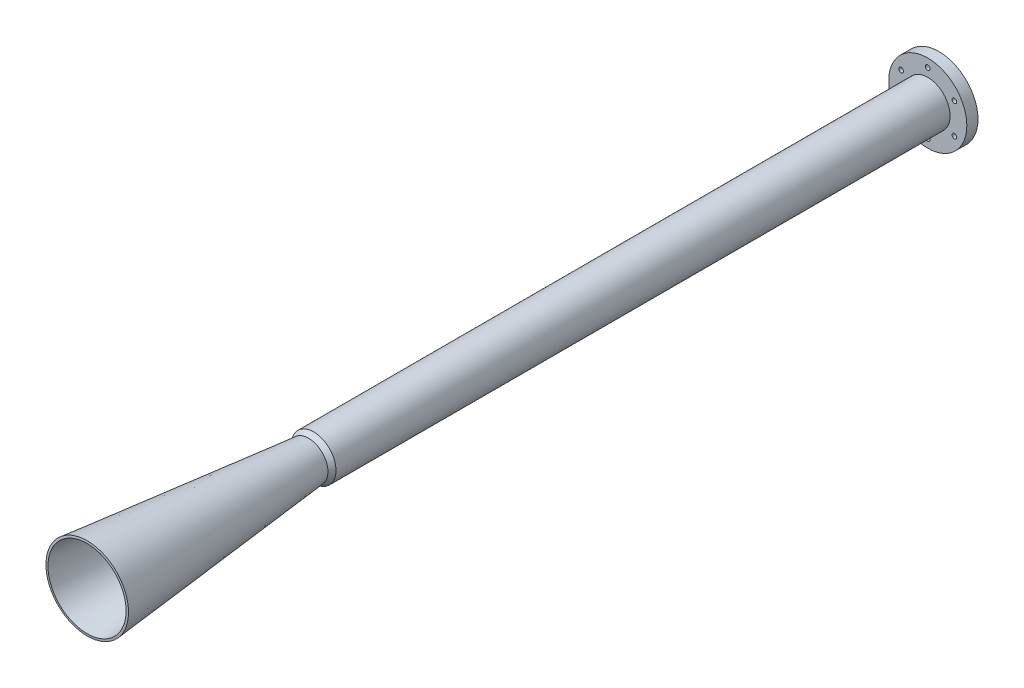
ISO-10303-21;
HEADER;
FILE_DESCRIPTION(('STEP AP214'),'2;1');
FILE_NAME('part.step','',(''),(''),'','','');
FILE_SCHEMA(('AUTOMOTIVE_DESIGN { 1 0 10303 214 1 1 1 1 }'));
ENDSEC;
DATA;
#1=APPLICATION_CONTEXT('core data for automotive mechanical design processes');
#2=APPLICATION_PROTOCOL_DEFINITION('international standard','automotive_design',2000,#1);
#3=PRODUCT_CONTEXT('',#1,'mechanical');
#4=PRODUCT('Part','Part','',(#3));
#5=PRODUCT_RELATED_PRODUCT_CATEGORY('part','',(#4));
#6=PRODUCT_DEFINITION_FORMATION('','',#4);
#7=PRODUCT_DEFINITION_CONTEXT('part definition',#1,'design');
#8=PRODUCT_DEFINITION('design','',#6,#7);
#9=PRODUCT_DEFINITION_SHAPE('','',#8);
#10=(LENGTH_UNIT() NAMED_UNIT(*) SI_UNIT(.MILLI.,.METRE.));
#11=(NAMED_UNIT(*) PLANE_ANGLE_UNIT() SI_UNIT($,.RADIAN.));
#12=(NAMED_UNIT(*) SI_UNIT($,.STERADIAN.) SOLID_ANGLE_UNIT());
#13=UNCERTAINTY_MEASURE_WITH_UNIT(LENGTH_MEASURE(1.E-05),#10,'distance_accuracy_value','');
#14=(GEOMETRIC_REPRESENTATION_CONTEXT(3) GLOBAL_UNCERTAINTY_ASSIGNED_CONTEXT((#13)) GLOBAL_UNIT_ASSIGNED_CONTEXT((#10,
#11,#12)) REPRESENTATION_CONTEXT('',''));
#15=CARTESIAN_POINT('',(0.,0.,0.));
#16=DIRECTION('',(0.,0.,1.));
#17=DIRECTION('',(1.,0.,0.));
#18=AXIS2_PLACEMENT_3D('',#15,#16,#17);
#19=CARTESIAN_POINT('',(0.,0.,752.802943709974));
#20=DIRECTION('',(0.,0.,1.));
#21=DIRECTION('',(1.,0.,0.));
#22=AXIS2_PLACEMENT_3D('',#19,#20,#21);
#23=CONICAL_SURFACE('',#22,36.9902685292596,0.0986882606484066);
#24=CARTESIAN_POINT('',(0.,0.,752.802943709974));
#25=DIRECTION('',(0.,0.,1.));
#26=DIRECTION('',(1.,0.,0.));
#27=AXIS2_PLACEMENT_3D('',#24,#25,#26);
#28=CIRCLE('',#27,36.9902685292596);
#29=CARTESIAN_POINT('',(36.9902685292596,0.,752.802943709974));
#30=VERTEX_POINT('',#29);
#31=EDGE_CURVE('E55',#30,#30,#28,.T.);
#32=ORIENTED_EDGE('',*,*,#31,.F.);
#33=EDGE_LOOP('',(#32));
#34=FACE_BOUND('',#33,.T.);
#35=CARTESIAN_POINT('',(0.,0.,554.567434606838));
#36=DIRECTION('',(0.,0.,-1.));
#37=DIRECTION('',(-1.,0.,0.));
#38=AXIS2_PLACEMENT_3D('',#35,#36,#37);
#39=CIRCLE('',#38,17.3629904002362);
#40=CARTESIAN_POINT('',(-17.3629904002362,0.,554.567434606838));
#41=VERTEX_POINT('',#40);
#42=EDGE_CURVE('E82',#41,#41,#39,.T.);
#43=ORIENTED_EDGE('',*,*,#42,.F.);
#44=EDGE_LOOP('',(#43));
#45=FACE_BOUND('',#44,.T.);
#46=ADVANCED_FACE('F38',(#34,#45),#23,.T.);
#47=CARTESIAN_POINT('',(0.,0.,1181.72985613874));
#48=DIRECTION('',(0.,0.,1.));
#49=DIRECTION('',(1.,0.,0.));
#50=AXIS2_PLACEMENT_3D('',#47,#48,#49);
#51=CYLINDRICAL_SURFACE('',#50,5.);
#52=CARTESIAN_POINT('',(0.,0.,450.));
#53=DIRECTION('',(0.,0.,1.));
#54=DIRECTION('',(1.,0.,0.));
#55=AXIS2_PLACEMENT_3D('',#52,#53,#54);
#56=CIRCLE('',#55,5.);
#57=CARTESIAN_POINT('',(5.,0.,450.));
#58=VERTEX_POINT('',#57);
#59=EDGE_CURVE('E46',#58,#58,#56,.T.);
#60=ORIENTED_EDGE('',*,*,#59,.T.);
#61=EDGE_LOOP('',(#60));
#62=FACE_BOUND('',#61,.T.);
#63=CARTESIAN_POINT('',(0.,0.,-10.));
#64=DIRECTION('',(0.,0.,1.));
#65=DIRECTION('',(1.,0.,0.));
#66=AXIS2_PLACEMENT_3D('',#63,#64,#65);
#67=CIRCLE('',#66,5.);
#68=CARTESIAN_POINT('',(5.,0.,-10.));
#69=VERTEX_POINT('',#68);
#70=EDGE_CURVE('E70',#69,#69,#67,.T.);
#71=ORIENTED_EDGE('',*,*,#70,.F.);
#72=EDGE_LOOP('',(#71));
#73=FACE_BOUND('',#72,.T.);
#74=ADVANCED_FACE('F40',(#62,#73),#51,.F.);
#75=CARTESIAN_POINT('',(0.,0.,753.));
#76=DIRECTION('',(0.,0.,1.));
#77=DIRECTION('',(1.,0.,0.));
#78=AXIS2_PLACEMENT_3D('',#75,#76,#77);
#79=CONICAL_SURFACE('',#78,35.,0.0986882606484065);
#80=CARTESIAN_POINT('',(0.,0.,753.));
#81=DIRECTION('',(0.,0.,1.));
#82=DIRECTION('',(1.,0.,0.));
#83=AXIS2_PLACEMENT_3D('',#80,#81,#82);
#84=CIRCLE('',#83,35.);
#85=CARTESIAN_POINT('',(35.,0.,753.));
#86=VERTEX_POINT('',#85);
#87=EDGE_CURVE('E50',#86,#86,#84,.T.);
#88=CARTESIAN_POINT('',(5.,0.,450.));
#89=CARTESIAN_POINT('',(5.3125,0.,453.15625));
#90=CARTESIAN_POINT('',(5.62500000000001,0.,456.3125));
#91=CARTESIAN_POINT('',(6.25,0.,462.625));
#92=CARTESIAN_POINT('',(6.5625,0.,465.78125));
#93=CARTESIAN_POINT('',(7.1875,0.,472.09375));
#94=CARTESIAN_POINT('',(7.5,0.,475.25));
#95=CARTESIAN_POINT('',(8.125,0.,481.5625));
#96=CARTESIAN_POINT('',(8.4375,0.,484.71875));
#97=CARTESIAN_POINT('',(9.0625,0.,491.03125));
#98=CARTESIAN_POINT('',(9.375,0.,494.1875));
#99=CARTESIAN_POINT('',(10.,0.,500.5));
#100=CARTESIAN_POINT('',(10.3125,0.,503.65625));
#101=CARTESIAN_POINT('',(10.9375,0.,509.96875));
#102=CARTESIAN_POINT('',(11.25,0.,513.125));
#103=CARTESIAN_POINT('',(11.875,0.,519.4375));
#104=CARTESIAN_POINT('',(12.1875,0.,522.59375));
#105=CARTESIAN_POINT('',(12.8125,0.,528.90625));
#106=CARTESIAN_POINT('',(13.125,0.,532.0625));
#107=CARTESIAN_POINT('',(13.75,0.,538.375));
#108=CARTESIAN_POINT('',(14.0625,0.,541.53125));
#109=CARTESIAN_POINT('',(14.6875,0.,547.84375));
#110=CARTESIAN_POINT('',(15.,0.,551.));
#111=CARTESIAN_POINT('',(15.625,0.,557.3125));
#112=CARTESIAN_POINT('',(15.9375,0.,560.46875));
#113=CARTESIAN_POINT('',(16.5625,0.,566.78125));
#114=CARTESIAN_POINT('',(16.875,0.,569.9375));
#115=CARTESIAN_POINT('',(17.5,0.,576.25));
#116=CARTESIAN_POINT('',(17.8125,0.,579.40625));
#117=CARTESIAN_POINT('',(18.4375,0.,585.71875));
#118=CARTESIAN_POINT('',(18.75,0.,588.875));
#119=CARTESIAN_POINT('',(19.375,0.,595.1875));
#120=CARTESIAN_POINT('',(19.6875,0.,598.34375));
#121=CARTESIAN_POINT('',(20.3125,0.,604.65625));
#122=CARTESIAN_POINT('',(20.625,0.,607.8125));
#123=CARTESIAN_POINT('',(21.25,0.,614.125));
#124=CARTESIAN_POINT('',(21.5625,0.,617.28125));
#125=CARTESIAN_POINT('',(22.1875,0.,623.59375));
#126=CARTESIAN_POINT('',(22.5,0.,626.75));
#127=CARTESIAN_POINT('',(23.125,0.,633.0625));
#128=CARTESIAN_POINT('',(23.4375,0.,636.21875));
#129=CARTESIAN_POINT('',(24.0625,0.,642.53125));
#130=CARTESIAN_POINT('',(24.375,0.,645.6875));
#131=CARTESIAN_POINT('',(25.,0.,652.));
#132=CARTESIAN_POINT('',(25.3125,0.,655.15625));
#133=CARTESIAN_POINT('',(25.9375,0.,661.46875));
#134=CARTESIAN_POINT('',(26.25,0.,664.625));
#135=CARTESIAN_POINT('',(26.875,0.,670.9375));
#136=CARTESIAN_POINT('',(27.1875,0.,674.09375));
#137=CARTESIAN_POINT('',(27.8125,0.,680.40625));
#138=CARTESIAN_POINT('',(28.125,0.,683.5625));
#139=CARTESIAN_POINT('',(28.75,0.,689.875));
#140=CARTESIAN_POINT('',(29.0625,0.,693.03125));
#141=CARTESIAN_POINT('',(29.6875,0.,699.34375));
#142=CARTESIAN_POINT('',(30.,0.,702.5));
#143=CARTESIAN_POINT('',(30.625,0.,708.8125));
#144=CARTESIAN_POINT('',(30.9375,0.,711.96875));
#145=CARTESIAN_POINT('',(31.5625,0.,718.28125));
#146=CARTESIAN_POINT('',(31.875,0.,721.4375));
#147=CARTESIAN_POINT('',(32.5,0.,727.75));
#148=CARTESIAN_POINT('',(32.8125,0.,730.90625));
#149=CARTESIAN_POINT('',(33.4375,0.,737.21875));
#150=CARTESIAN_POINT('',(33.75,0.,740.375));
#151=CARTESIAN_POINT('',(34.375,0.,746.6875));
#152=CARTESIAN_POINT('',(34.6875,0.,749.84375));
#153=CARTESIAN_POINT('',(35.,0.,753.));
#154=B_SPLINE_CURVE_WITH_KNOTS('',3,(#88,#89,#90,#91,#92,#93,#94,#95,#96,#97,#98,#99,#100,#101,
#102,#103,#104,#105,#106,#107,#108,#109,#110,#111,#112,#113,#114,#115,#116,#117,#118,#119,#120,
#121,#122,#123,#124,#125,#126,#127,#128,#129,#130,#131,#132,#133,#134,#135,#136,#137,#138,#139,
#140,#141,#142,#143,#144,#145,#146,#147,#148,#149,#150,#151,#152,#153),.UNSPECIFIED.,.F.,.F.,(4,
2,2,2,2,2,2,2,2,2,2,2,2,2,2,2,2,2,2,2,2,2,2,2,2,2,2,2,2,2,2,2,4),(0.,9.51504770416315,
19.0300954083263,28.5451431124894,38.0601908166525,47.5752385208157,57.0902862249787,
66.605333929142,76.120381633305,85.6354293374682,95.1504770416313,104.665524745794,
114.180572449958,123.695620154121,133.210667858284,142.725715562447,152.24076326661,
161.755810970773,171.270858674936,180.785906379099,190.300954083262,199.816001787426,
209.331049491589,218.846097195752,228.361144899915,237.876192604078,247.391240308241,
256.906288012404,266.421335716568,275.936383420731,285.451431124894,294.966478829057,
304.48152653322),.UNSPECIFIED.);
#155=EDGE_CURVE('BSEAM159',#58,#86,#154,.T.);
#156=ORIENTED_EDGE('',*,*,#59,.F.);
#157=ORIENTED_EDGE('',*,*,#87,.T.);
#158=ORIENTED_EDGE('',*,*,#155,.T.);
#159=ORIENTED_EDGE('',*,*,#155,.F.);
#160=EDGE_LOOP('',(#156,#158,#157,#159));
#161=FACE_BOUND('',#160,.T.);
#162=ADVANCED_FACE('F159',(#161),#79,.F.);
#163=CARTESIAN_POINT('',(0.,0.,753.));
#164=DIRECTION('',(0.,0.,-1.));
#165=DIRECTION('',(-1.,0.,0.));
#166=AXIS2_PLACEMENT_3D('',#163,#164,#165);
#167=CONICAL_SURFACE('',#166,35.,1.47210806614647);
#168=ORIENTED_EDGE('',*,*,#31,.T.);
#169=EDGE_LOOP('',(#168));
#170=FACE_BOUND('',#169,.T.);
#171=ORIENTED_EDGE('',*,*,#87,.F.);
#172=EDGE_LOOP('',(#171));
#173=FACE_BOUND('',#172,.T.);
#174=ADVANCED_FACE('F128',(#170,#173),#167,.T.);
#175=CARTESIAN_POINT('',(0.,5.,0.));
#176=DIRECTION('',(0.,0.,-1.));
#177=DIRECTION('',(-1.,0.,0.));
#178=AXIS2_PLACEMENT_3D('',#175,#176,#177);
#179=PLANE('',#178);
#180=CARTESIAN_POINT('',(-23.8156986040721,13.75,0.));
#181=DIRECTION('',(0.,0.,1.));
#182=DIRECTION('',(1.,0.,0.));
#183=AXIS2_PLACEMENT_3D('',#180,#181,#182);
#184=CIRCLE('',#183,2.09999999999999);
#185=CARTESIAN_POINT('',(-21.7156986040721,13.75,0.));
#186=VERTEX_POINT('',#185);
#187=EDGE_CURVE('E118',#186,#186,#184,.T.);
#188=ORIENTED_EDGE('',*,*,#187,.F.);
#189=EDGE_LOOP('',(#188));
#190=FACE_BOUND('',#189,.T.);
#191=CARTESIAN_POINT('',(0.,27.5,0.));
#192=DIRECTION('',(0.,0.,1.));
#193=DIRECTION('',(1.,0.,0.));
#194=AXIS2_PLACEMENT_3D('',#191,#192,#193);
#195=CIRCLE('',#194,2.09999999999999);
#196=CARTESIAN_POINT('',(2.09999999999999,27.5,0.));
#197=VERTEX_POINT('',#196);
#198=EDGE_CURVE('E112',#197,#197,#195,.T.);
#199=ORIENTED_EDGE('',*,*,#198,.F.);
#200=EDGE_LOOP('',(#199));
#201=FACE_BOUND('',#200,.T.);
#202=CARTESIAN_POINT('',(23.8156986040721,13.75,0.));
#203=DIRECTION('',(0.,0.,1.));
#204=DIRECTION('',(1.,0.,0.));
#205=AXIS2_PLACEMENT_3D('',#202,#203,#204);
#206=CIRCLE('',#205,2.09999999999999);
#207=CARTESIAN_POINT('',(25.9156986040721,13.75,0.));
#208=VERTEX_POINT('',#207);
#209=EDGE_CURVE('E106',#208,#208,#206,.T.);
#210=ORIENTED_EDGE('',*,*,#209,.F.);
#211=EDGE_LOOP('',(#210));
#212=FACE_BOUND('',#211,.T.);
#213=CARTESIAN_POINT('',(23.8156986040721,-13.75,0.));
#214=DIRECTION('',(0.,0.,1.));
#215=DIRECTION('',(1.,0.,0.));
#216=AXIS2_PLACEMENT_3D('',#213,#214,#215);
#217=CIRCLE('',#216,2.09999999999999);
#218=CARTESIAN_POINT('',(25.9156986040721,-13.75,0.));
#219=VERTEX_POINT('',#218);
#220=EDGE_CURVE('E100',#219,#219,#217,.T.);
#221=ORIENTED_EDGE('',*,*,#220,.F.);
#222=EDGE_LOOP('',(#221));
#223=FACE_BOUND('',#222,.T.);
#224=CARTESIAN_POINT('',(-23.8156986040721,-13.75,0.));
#225=DIRECTION('',(0.,0.,1.));
#226=DIRECTION('',(1.,0.,0.));
#227=AXIS2_PLACEMENT_3D('',#224,#225,#226);
#228=CIRCLE('',#227,2.09999999999999);
#229=CARTESIAN_POINT('',(-21.7156986040721,-13.75,0.));
#230=VERTEX_POINT('',#229);
#231=EDGE_CURVE('E94',#230,#230,#228,.T.);
#232=ORIENTED_EDGE('',*,*,#231,.F.);
#233=EDGE_LOOP('',(#232));
#234=FACE_BOUND('',#233,.T.);
#235=CARTESIAN_POINT('',(0.,-27.5,0.));
#236=DIRECTION('',(0.,0.,1.));
#237=DIRECTION('',(1.,0.,0.));
#238=AXIS2_PLACEMENT_3D('',#235,#236,#237);
#239=CIRCLE('',#238,2.09999999999999);
#240=CARTESIAN_POINT('',(2.1,-27.5,0.));
#241=VERTEX_POINT('',#240);
#242=EDGE_CURVE('E88',#241,#241,#239,.T.);
#243=ORIENTED_EDGE('',*,*,#242,.F.);
#244=EDGE_LOOP('',(#243));
#245=FACE_BOUND('',#244,.T.);
#246=CARTESIAN_POINT('',(0.,0.,0.));
#247=DIRECTION('',(0.,0.,-1.));
#248=DIRECTION('',(-1.,0.,0.));
#249=AXIS2_PLACEMENT_3D('',#246,#247,#248);
#250=CIRCLE('',#249,20.);
#251=CARTESIAN_POINT('',(-20.,0.,0.));
#252=VERTEX_POINT('',#251);
#253=EDGE_CURVE('E76',#252,#252,#250,.T.);
#254=ORIENTED_EDGE('',*,*,#253,.T.);
#255=EDGE_LOOP('',(#254));
#256=FACE_BOUND('',#255,.T.);
#257=CARTESIAN_POINT('',(0.,0.,0.));
#258=DIRECTION('',(0.,0.,1.));
#259=DIRECTION('',(1.,0.,0.));
#260=AXIS2_PLACEMENT_3D('',#257,#258,#259);
#261=CIRCLE('',#260,35.);
#262=CARTESIAN_POINT('',(35.,0.,0.));
#263=VERTEX_POINT('',#262);
#264=EDGE_CURVE('E64',#263,#263,#261,.T.);
#265=ORIENTED_EDGE('',*,*,#264,.T.);
#266=EDGE_LOOP('',(#265));
#267=FACE_BOUND('',#266,.T.);
#268=ADVANCED_FACE('F124',(#190,#201,#212,#223,#234,#245,#256,#267),#179,.F.);
#269=CARTESIAN_POINT('',(0.,0.,1181.72985613874));
#270=DIRECTION('',(0.,0.,1.));
#271=DIRECTION('',(1.,0.,0.));
#272=AXIS2_PLACEMENT_3D('',#269,#270,#271);
#273=CYLINDRICAL_SURFACE('',#272,35.);
#274=ORIENTED_EDGE('',*,*,#264,.F.);
#275=EDGE_LOOP('',(#274));
#276=FACE_BOUND('',#275,.T.);
#277=CARTESIAN_POINT('',(0.,0.,-10.));
#278=DIRECTION('',(0.,0.,1.));
#279=DIRECTION('',(1.,0.,0.));
#280=AXIS2_PLACEMENT_3D('',#277,#278,#279);
#281=CIRCLE('',#280,35.);
#282=CARTESIAN_POINT('',(35.,0.,-10.));
#283=VERTEX_POINT('',#282);
#284=EDGE_CURVE('E67',#283,#283,#281,.T.);
#285=ORIENTED_EDGE('',*,*,#284,.T.);
#286=EDGE_LOOP('',(#285));
#287=FACE_BOUND('',#286,.T.);
#288=ADVANCED_FACE('F127',(#276,#287),#273,.T.);
#289=CARTESIAN_POINT('',(0.,14.9999999999998,-10.));
#290=DIRECTION('',(0.,0.,1.));
#291=DIRECTION('',(1.,0.,0.));
#292=AXIS2_PLACEMENT_3D('',#289,#290,#291);
#293=PLANE('',#292);
#294=CARTESIAN_POINT('',(-23.8156986040721,13.75,-10.));
#295=DIRECTION('',(0.,0.,1.));
#296=DIRECTION('',(1.,0.,0.));
#297=AXIS2_PLACEMENT_3D('',#294,#295,#296);
#298=CIRCLE('',#297,2.1);
#299=CARTESIAN_POINT('',(-21.7156986040721,13.75,-10.));
#300=VERTEX_POINT('',#299);
#301=EDGE_CURVE('E115',#300,#300,#298,.T.);
#302=ORIENTED_EDGE('',*,*,#301,.T.);
#303=EDGE_LOOP('',(#302));
#304=FACE_BOUND('',#303,.T.);
#305=CARTESIAN_POINT('',(0.,27.5,-10.));
#306=DIRECTION('',(0.,0.,1.));
#307=DIRECTION('',(1.,0.,0.));
#308=AXIS2_PLACEMENT_3D('',#305,#306,#307);
#309=CIRCLE('',#308,2.1);
#310=CARTESIAN_POINT('',(2.1,27.5,-10.));
#311=VERTEX_POINT('',#310);
#312=EDGE_CURVE('E109',#311,#311,#309,.T.);
#313=ORIENTED_EDGE('',*,*,#312,.T.);
#314=EDGE_LOOP('',(#313));
#315=FACE_BOUND('',#314,.T.);
#316=CARTESIAN_POINT('',(23.8156986040721,13.75,-10.));
#317=DIRECTION('',(0.,0.,1.));
#318=DIRECTION('',(1.,0.,0.));
#319=AXIS2_PLACEMENT_3D('',#316,#317,#318);
#320=CIRCLE('',#319,2.1);
#321=CARTESIAN_POINT('',(25.9156986040721,13.75,-10.));
#322=VERTEX_POINT('',#321);
#323=EDGE_CURVE('E103',#322,#322,#320,.T.);
#324=ORIENTED_EDGE('',*,*,#323,.T.);
#325=EDGE_LOOP('',(#324));
#326=FACE_BOUND('',#325,.T.);
#327=CARTESIAN_POINT('',(23.8156986040721,-13.75,-10.));
#328=DIRECTION('',(0.,0.,1.));
#329=DIRECTION('',(1.,0.,0.));
#330=AXIS2_PLACEMENT_3D('',#327,#328,#329);
#331=CIRCLE('',#330,2.1);
#332=CARTESIAN_POINT('',(25.9156986040721,-13.75,-10.));
#333=VERTEX_POINT('',#332);
#334=EDGE_CURVE('E97',#333,#333,#331,.T.);
#335=ORIENTED_EDGE('',*,*,#334,.T.);
#336=EDGE_LOOP('',(#335));
#337=FACE_BOUND('',#336,.T.);
#338=CARTESIAN_POINT('',(-23.8156986040721,-13.75,-10.));
#339=DIRECTION('',(0.,0.,1.));
#340=DIRECTION('',(1.,0.,0.));
#341=AXIS2_PLACEMENT_3D('',#338,#339,#340);
#342=CIRCLE('',#341,2.1);
#343=CARTESIAN_POINT('',(-21.7156986040721,-13.75,-10.));
#344=VERTEX_POINT('',#343);
#345=EDGE_CURVE('E91',#344,#344,#342,.T.);
#346=ORIENTED_EDGE('',*,*,#345,.T.);
#347=EDGE_LOOP('',(#346));
#348=FACE_BOUND('',#347,.T.);
#349=CARTESIAN_POINT('',(0.,-27.5,-10.));
#350=DIRECTION('',(0.,0.,1.));
#351=DIRECTION('',(1.,0.,0.));
#352=AXIS2_PLACEMENT_3D('',#349,#350,#351);
#353=CIRCLE('',#352,2.1);
#354=CARTESIAN_POINT('',(2.10000000000001,-27.5,-10.));
#355=VERTEX_POINT('',#354);
#356=EDGE_CURVE('E85',#355,#355,#353,.T.);
#357=ORIENTED_EDGE('',*,*,#356,.T.);
#358=EDGE_LOOP('',(#357));
#359=FACE_BOUND('',#358,.T.);
#360=ORIENTED_EDGE('',*,*,#284,.F.);
#361=EDGE_LOOP('',(#360));
#362=FACE_BOUND('',#361,.T.);
#363=ORIENTED_EDGE('',*,*,#70,.T.);
#364=EDGE_LOOP('',(#363));
#365=FACE_BOUND('',#364,.T.);
#366=ADVANCED_FACE('F147',(#304,#315,#326,#337,#348,#359,#362,#365),#293,.F.);
#367=CARTESIAN_POINT('',(0.,0.,-54.4085783239718));
#368=DIRECTION('',(0.,0.,-1.));
#369=DIRECTION('',(-1.,0.,0.));
#370=AXIS2_PLACEMENT_3D('',#367,#368,#369);
#371=CYLINDRICAL_SURFACE('',#370,20.);
#372=CARTESIAN_POINT('',(0.,0.,550.));
#373=DIRECTION('',(0.,0.,-1.));
#374=DIRECTION('',(-1.,0.,0.));
#375=AXIS2_PLACEMENT_3D('',#372,#373,#374);
#376=CIRCLE('',#375,19.9999999999999);
#377=CARTESIAN_POINT('',(-19.9999999999999,0.,550.));
#378=VERTEX_POINT('',#377);
#379=EDGE_CURVE('E73',#378,#378,#376,.T.);
#380=ORIENTED_EDGE('',*,*,#379,.T.);
#381=EDGE_LOOP('',(#380));
#382=FACE_BOUND('',#381,.T.);
#383=ORIENTED_EDGE('',*,*,#253,.F.);
#384=EDGE_LOOP('',(#383));
#385=FACE_BOUND('',#384,.T.);
#386=ADVANCED_FACE('F153',(#382,#385),#371,.T.);
#387=CARTESIAN_POINT('',(0.,0.,550.));
#388=DIRECTION('',(0.,0.,-1.));
#389=DIRECTION('',(-1.,0.,0.));
#390=AXIS2_PLACEMENT_3D('',#387,#388,#389);
#391=CONICAL_SURFACE('',#390,19.9999999999999,0.5235987755983);
#392=ORIENTED_EDGE('',*,*,#42,.T.);
#393=EDGE_LOOP('',(#392));
#394=FACE_BOUND('',#393,.T.);
#395=ORIENTED_EDGE('',*,*,#379,.F.);
#396=EDGE_LOOP('',(#395));
#397=FACE_BOUND('',#396,.T.);
#398=ADVANCED_FACE('F187',(#394,#397),#391,.T.);
#399=CARTESIAN_POINT('',(0.,-27.5,0.));
#400=DIRECTION('',(0.,0.,1.));
#401=DIRECTION('',(1.,0.,0.));
#402=AXIS2_PLACEMENT_3D('',#399,#400,#401);
#403=CYLINDRICAL_SURFACE('',#402,2.09999999999999);
#404=ORIENTED_EDGE('',*,*,#356,.F.);
#405=EDGE_LOOP('',(#404));
#406=FACE_BOUND('',#405,.T.);
#407=ORIENTED_EDGE('',*,*,#242,.T.);
#408=EDGE_LOOP('',(#407));
#409=FACE_BOUND('',#408,.T.);
#410=ADVANCED_FACE('F190',(#406,#409),#403,.F.);
#411=CARTESIAN_POINT('',(-23.8156986040721,-13.75,0.));
#412=DIRECTION('',(0.,0.,1.));
#413=DIRECTION('',(1.,0.,0.));
#414=AXIS2_PLACEMENT_3D('',#411,#412,#413);
#415=CYLINDRICAL_SURFACE('',#414,2.09999999999999);
#416=ORIENTED_EDGE('',*,*,#345,.F.);
#417=EDGE_LOOP('',(#416));
#418=FACE_BOUND('',#417,.T.);
#419=ORIENTED_EDGE('',*,*,#231,.T.);
#420=EDGE_LOOP('',(#419));
#421=FACE_BOUND('',#420,.T.);
#422=ADVANCED_FACE('F204',(#418,#421),#415,.F.);
#423=CARTESIAN_POINT('',(23.8156986040721,-13.75,0.));
#424=DIRECTION('',(0.,0.,1.));
#425=DIRECTION('',(1.,0.,0.));
#426=AXIS2_PLACEMENT_3D('',#423,#424,#425);
#427=CYLINDRICAL_SURFACE('',#426,2.09999999999999);
#428=ORIENTED_EDGE('',*,*,#334,.F.);
#429=EDGE_LOOP('',(#428));
#430=FACE_BOUND('',#429,.T.);
#431=ORIENTED_EDGE('',*,*,#220,.T.);
#432=EDGE_LOOP('',(#431));
#433=FACE_BOUND('',#432,.T.);
#434=ADVANCED_FACE('F208',(#430,#433),#427,.F.);
#435=CARTESIAN_POINT('',(23.8156986040721,13.75,0.));
#436=DIRECTION('',(0.,0.,1.));
#437=DIRECTION('',(1.,0.,0.));
#438=AXIS2_PLACEMENT_3D('',#435,#436,#437);
#439=CYLINDRICAL_SURFACE('',#438,2.09999999999999);
#440=ORIENTED_EDGE('',*,*,#323,.F.);
#441=EDGE_LOOP('',(#440));
#442=FACE_BOUND('',#441,.T.);
#443=ORIENTED_EDGE('',*,*,#209,.T.);
#444=EDGE_LOOP('',(#443));
#445=FACE_BOUND('',#444,.T.);
#446=ADVANCED_FACE('F212',(#442,#445),#439,.F.);
#447=CARTESIAN_POINT('',(0.,27.5,0.));
#448=DIRECTION('',(0.,0.,1.));
#449=DIRECTION('',(1.,0.,0.));
#450=AXIS2_PLACEMENT_3D('',#447,#448,#449);
#451=CYLINDRICAL_SURFACE('',#450,2.09999999999999);
#452=ORIENTED_EDGE('',*,*,#312,.F.);
#453=EDGE_LOOP('',(#452));
#454=FACE_BOUND('',#453,.T.);
#455=ORIENTED_EDGE('',*,*,#198,.T.);
#456=EDGE_LOOP('',(#455));
#457=FACE_BOUND('',#456,.T.);
#458=ADVANCED_FACE('F216',(#454,#457),#451,.F.);
#459=CARTESIAN_POINT('',(-23.8156986040721,13.75,0.));
#460=DIRECTION('',(0.,0.,1.));
#461=DIRECTION('',(1.,0.,0.));
#462=AXIS2_PLACEMENT_3D('',#459,#460,#461);
#463=CYLINDRICAL_SURFACE('',#462,2.09999999999999);
#464=ORIENTED_EDGE('',*,*,#301,.F.);
#465=EDGE_LOOP('',(#464));
#466=FACE_BOUND('',#465,.T.);
#467=ORIENTED_EDGE('',*,*,#187,.T.);
#468=EDGE_LOOP('',(#467));
#469=FACE_BOUND('',#468,.T.);
#470=ADVANCED_FACE('F122',(#466,#469),#463,.F.);
#471=CLOSED_SHELL('',(#46,#74,#162,#174,#268,#288,#366,#386,#398,#410,#422,#434,#446,#458,#470));
#472=CARTESIAN_POINT('',(0.,0.,-54.4085783239718));
#473=DIRECTION('',(0.,0.,-1.));
#474=DIRECTION('',(-1.,0.,0.));
#475=AXIS2_PLACEMENT_3D('',#472,#473,#474);
#476=CYLINDRICAL_SURFACE('',#475,18.);
#477=CARTESIAN_POINT('',(0.,0.,549.464101615138));
#478=DIRECTION('',(0.,0.,-1.));
#479=DIRECTION('',(-1.,0.,0.));
#480=AXIS2_PLACEMENT_3D('',#477,#478,#479);
#481=CIRCLE('',#480,17.9999999999999);
#482=CARTESIAN_POINT('',(-17.9999999999999,0.,549.464101615138));
#483=VERTEX_POINT('',#482);
#484=EDGE_CURVE('E79',#483,#483,#481,.T.);
#485=ORIENTED_EDGE('',*,*,#484,.F.);
#486=EDGE_LOOP('',(#485));
#487=FACE_BOUND('',#486,.T.);
#488=CARTESIAN_POINT('',(0.,0.,0.));
#489=DIRECTION('',(0.,0.,-1.));
#490=DIRECTION('',(-1.,0.,0.));
#491=AXIS2_PLACEMENT_3D('',#488,#489,#490);
#492=CIRCLE('',#491,18.);
#493=CARTESIAN_POINT('',(-18.,0.,0.));
#494=VERTEX_POINT('',#493);
#495=EDGE_CURVE('E10',#494,#494,#492,.T.);
#496=ORIENTED_EDGE('',*,*,#495,.T.);
#497=EDGE_LOOP('',(#496));
#498=FACE_BOUND('',#497,.T.);
#499=ADVANCED_FACE('F195',(#487,#498),#476,.F.);
#500=CARTESIAN_POINT('',(0.,0.,549.464101615138));
#501=DIRECTION('',(0.,0.,-1.));
#502=DIRECTION('',(-1.,0.,0.));
#503=AXIS2_PLACEMENT_3D('',#500,#501,#502);
#504=CONICAL_SURFACE('',#503,17.9999999999999,0.523598775598301);
#505=CARTESIAN_POINT('',(0.,0.,551.152980032813));
#506=DIRECTION('',(0.,0.,-1.));
#507=DIRECTION('',(-1.,0.,0.));
#508=AXIS2_PLACEMENT_3D('',#505,#506,#507);
#509=CIRCLE('',#508,17.0249255909268);
#510=CARTESIAN_POINT('',(-17.0249255909268,0.,551.152980032813));
#511=VERTEX_POINT('',#510);
#512=EDGE_CURVE('E42',#511,#511,#509,.T.);
#513=ORIENTED_EDGE('',*,*,#512,.F.);
#514=EDGE_LOOP('',(#513));
#515=FACE_BOUND('',#514,.T.);
#516=ORIENTED_EDGE('',*,*,#484,.T.);
#517=EDGE_LOOP('',(#516));
#518=FACE_BOUND('',#517,.T.);
#519=ADVANCED_FACE('F181',(#515,#518),#504,.F.);
#520=CARTESIAN_POINT('',(0.,0.,449.901231564452));
#521=DIRECTION('',(0.,0.,1.));
#522=DIRECTION('',(1.,0.,0.));
#523=AXIS2_PLACEMENT_3D('',#520,#521,#522);
#524=CIRCLE('',#523,7.);
#525=CARTESIAN_POINT('',(7.,0.,449.901231564452));
#526=VERTEX_POINT('',#525);
#527=EDGE_CURVE('E58',#526,#526,#524,.T.);
#528=ORIENTED_EDGE('',*,*,#527,.T.);
#529=EDGE_LOOP('',(#528));
#530=FACE_BOUND('',#529,.T.);
#531=ORIENTED_EDGE('',*,*,#512,.T.);
#532=EDGE_LOOP('',(#531));
#533=FACE_BOUND('',#532,.T.);
#534=ADVANCED_FACE('F168',(#530,#533),#23,.T.);
#535=CARTESIAN_POINT('',(0.,0.,1181.72985613874));
#536=DIRECTION('',(0.,0.,1.));
#537=DIRECTION('',(1.,0.,0.));
#538=AXIS2_PLACEMENT_3D('',#535,#536,#537);
#539=CYLINDRICAL_SURFACE('',#538,7.);
#540=CARTESIAN_POINT('',(0.,0.,0.));
#541=DIRECTION('',(0.,0.,1.));
#542=DIRECTION('',(1.,0.,0.));
#543=AXIS2_PLACEMENT_3D('',#540,#541,#542);
#544=CIRCLE('',#543,7.);
#545=CARTESIAN_POINT('',(7.,0.,0.));
#546=VERTEX_POINT('',#545);
#547=EDGE_CURVE('E61',#546,#546,#544,.T.);
#548=ORIENTED_EDGE('',*,*,#547,.T.);
#549=EDGE_LOOP('',(#548));
#550=FACE_BOUND('',#549,.T.);
#551=ORIENTED_EDGE('',*,*,#527,.F.);
#552=EDGE_LOOP('',(#551));
#553=FACE_BOUND('',#552,.T.);
#554=ADVANCED_FACE('F180',(#550,#553),#539,.T.);
#555=ORIENTED_EDGE('',*,*,#547,.F.);
#556=EDGE_LOOP('',(#555));
#557=FACE_BOUND('',#556,.T.);
#558=ORIENTED_EDGE('',*,*,#495,.F.);
#559=EDGE_LOOP('',(#558));
#560=FACE_BOUND('',#559,.T.);
#561=ADVANCED_FACE('F130',(#557,#560),#179,.F.);
#562=CLOSED_SHELL('',(#499,#519,#534,#554,#561));
#563=ORIENTED_CLOSED_SHELL('',*,#562,.T.);
#564=BREP_WITH_VOIDS('B2',#471,(#563));
#565=ADVANCED_BREP_SHAPE_REPRESENTATION('',(#18,#564),#14);
#566=SHAPE_DEFINITION_REPRESENTATION(#9,#565);
ENDSEC;
END-ISO-10303-21;
